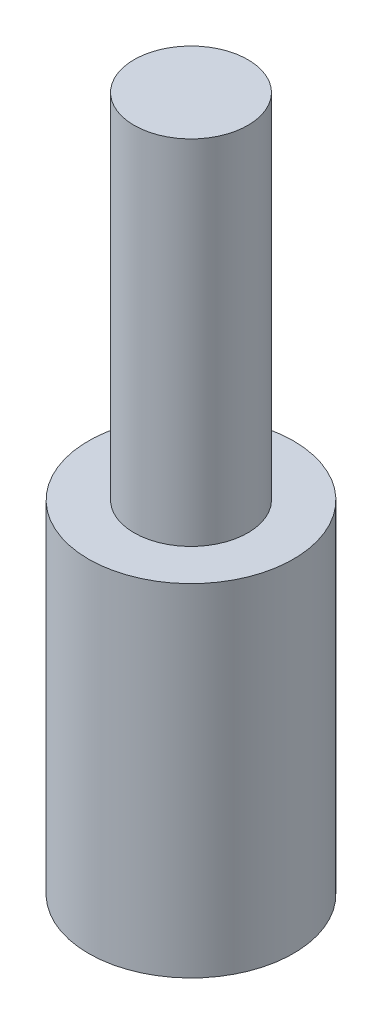
ISO-10303-21;
HEADER;
FILE_DESCRIPTION(('STEP AP214'),'2;1');
FILE_NAME('part.step','',(''),(''),'','','');
FILE_SCHEMA(('AUTOMOTIVE_DESIGN { 1 0 10303 214 1 1 1 1 }'));
ENDSEC;
DATA;
#1=APPLICATION_CONTEXT('core data for automotive mechanical design processes');
#2=APPLICATION_PROTOCOL_DEFINITION('international standard','automotive_design',2000,#1);
#3=PRODUCT_CONTEXT('',#1,'mechanical');
#4=PRODUCT('Part','Part','',(#3));
#5=PRODUCT_RELATED_PRODUCT_CATEGORY('part','',(#4));
#6=PRODUCT_DEFINITION_FORMATION('','',#4);
#7=PRODUCT_DEFINITION_CONTEXT('part definition',#1,'design');
#8=PRODUCT_DEFINITION('design','',#6,#7);
#9=PRODUCT_DEFINITION_SHAPE('','',#8);
#10=(LENGTH_UNIT() NAMED_UNIT(*) SI_UNIT(.MILLI.,.METRE.));
#11=(NAMED_UNIT(*) PLANE_ANGLE_UNIT() SI_UNIT($,.RADIAN.));
#12=(NAMED_UNIT(*) SI_UNIT($,.STERADIAN.) SOLID_ANGLE_UNIT());
#13=UNCERTAINTY_MEASURE_WITH_UNIT(LENGTH_MEASURE(1.E-05),#10,'distance_accuracy_value','');
#14=(GEOMETRIC_REPRESENTATION_CONTEXT(3) GLOBAL_UNCERTAINTY_ASSIGNED_CONTEXT((#13)) GLOBAL_UNIT_ASSIGNED_CONTEXT((#10,
#11,#12)) REPRESENTATION_CONTEXT('',''));
#15=CARTESIAN_POINT('',(0.,0.,0.));
#16=DIRECTION('',(0.,0.,1.));
#17=DIRECTION('',(1.,0.,0.));
#18=AXIS2_PLACEMENT_3D('',#15,#16,#17);
#19=CARTESIAN_POINT('',(0.,12.,0.));
#20=DIRECTION('',(0.,-1.,0.));
#21=DIRECTION('',(0.,0.,-1.));
#22=AXIS2_PLACEMENT_3D('',#19,#20,#21);
#23=CYLINDRICAL_SURFACE('',#22,3.);
#24=CARTESIAN_POINT('',(0.,0.,0.));
#25=DIRECTION('',(0.,1.,0.));
#26=DIRECTION('',(0.,0.,1.));
#27=AXIS2_PLACEMENT_3D('',#24,#25,#26);
#28=CIRCLE('',#27,3.);
#29=CARTESIAN_POINT('',(-1.6583123951777,0.,-2.5));
#30=VERTEX_POINT('',#29);
#31=CARTESIAN_POINT('',(1.6583123951777,0.,-2.5));
#32=VERTEX_POINT('',#31);
#33=EDGE_CURVE('E77',#30,#32,#28,.T.);
#34=ORIENTED_EDGE('',*,*,#33,.F.);
#35=DIRECTION('',(0.,-1.,0.));
#36=VECTOR('',#35,1.);
#37=CARTESIAN_POINT('',(-1.6583123951777,12.,-2.5));
#38=LINE('',#37,#36);
#39=CARTESIAN_POINT('',(-1.6583123951777,12.,-2.5));
#40=VERTEX_POINT('',#39);
#41=EDGE_CURVE('E40',#40,#30,#38,.T.);
#42=ORIENTED_EDGE('',*,*,#41,.F.);
#43=CARTESIAN_POINT('',(0.,12.,0.));
#44=DIRECTION('',(0.,1.,0.));
#45=DIRECTION('',(0.,0.,1.));
#46=AXIS2_PLACEMENT_3D('',#43,#44,#45);
#47=CIRCLE('',#46,3.);
#48=CARTESIAN_POINT('',(1.6583123951777,12.,-2.5));
#49=VERTEX_POINT('',#48);
#50=EDGE_CURVE('E62',#40,#49,#47,.T.);
#51=ORIENTED_EDGE('',*,*,#50,.T.);
#52=DIRECTION('',(0.,-1.,0.));
#53=VECTOR('',#52,1.);
#54=CARTESIAN_POINT('',(1.6583123951777,12.,-2.5));
#55=LINE('',#54,#53);
#56=EDGE_CURVE('E64',#49,#32,#55,.T.);
#57=ORIENTED_EDGE('',*,*,#56,.T.);
#58=EDGE_LOOP('',(#34,#42,#51,#57));
#59=FACE_BOUND('',#58,.T.);
#60=ADVANCED_FACE('F37',(#59),#23,.F.);
#61=CARTESIAN_POINT('',(0.,12.,-2.5));
#62=DIRECTION('',(0.,0.,-1.));
#63=DIRECTION('',(-1.,0.,0.));
#64=AXIS2_PLACEMENT_3D('',#61,#62,#63);
#65=PLANE('',#64);
#66=DIRECTION('',(1.,0.,0.));
#67=VECTOR('',#66,1.);
#68=CARTESIAN_POINT('',(0.,0.,-2.5));
#69=LINE('',#68,#67);
#70=EDGE_CURVE('E71',#30,#32,#69,.T.);
#71=ORIENTED_EDGE('',*,*,#70,.T.);
#72=ORIENTED_EDGE('',*,*,#56,.F.);
#73=DIRECTION('',(1.,0.,0.));
#74=VECTOR('',#73,1.);
#75=CARTESIAN_POINT('',(0.,12.,-2.5));
#76=LINE('',#75,#74);
#77=EDGE_CURVE('E67',#40,#49,#76,.T.);
#78=ORIENTED_EDGE('',*,*,#77,.F.);
#79=ORIENTED_EDGE('',*,*,#41,.T.);
#80=EDGE_LOOP('',(#71,#72,#78,#79));
#81=FACE_BOUND('',#80,.T.);
#82=ADVANCED_FACE('F70',(#81),#65,.F.);
#83=CARTESIAN_POINT('',(0.,12.,0.));
#84=DIRECTION('',(0.,-1.,0.));
#85=DIRECTION('',(0.,0.,-1.));
#86=AXIS2_PLACEMENT_3D('',#83,#84,#85);
#87=CYLINDRICAL_SURFACE('',#86,4.5);
#88=CARTESIAN_POINT('',(0.,0.,0.));
#89=DIRECTION('',(0.,1.,0.));
#90=DIRECTION('',(0.,0.,1.));
#91=AXIS2_PLACEMENT_3D('',#88,#89,#90);
#92=CIRCLE('',#91,4.5);
#93=CARTESIAN_POINT('',(0.,0.,4.5));
#94=VERTEX_POINT('',#93);
#95=EDGE_CURVE('E68',#94,#94,#92,.T.);
#96=ORIENTED_EDGE('',*,*,#95,.T.);
#97=EDGE_LOOP('',(#96));
#98=FACE_BOUND('',#97,.T.);
#99=CARTESIAN_POINT('',(0.,15.,0.));
#100=DIRECTION('',(0.,1.,0.));
#101=DIRECTION('',(0.,0.,1.));
#102=AXIS2_PLACEMENT_3D('',#99,#100,#101);
#103=CIRCLE('',#102,4.5);
#104=CARTESIAN_POINT('',(0.,15.,4.5));
#105=VERTEX_POINT('',#104);
#106=EDGE_CURVE('E79',#105,#105,#103,.T.);
#107=ORIENTED_EDGE('',*,*,#106,.F.);
#108=EDGE_LOOP('',(#107));
#109=FACE_BOUND('',#108,.T.);
#110=ADVANCED_FACE('F84',(#98,#109),#87,.T.);
#111=CARTESIAN_POINT('',(0.,0.,0.));
#112=DIRECTION('',(0.,1.,0.));
#113=DIRECTION('',(0.,0.,1.));
#114=AXIS2_PLACEMENT_3D('',#111,#112,#113);
#115=PLANE('',#114);
#116=ORIENTED_EDGE('',*,*,#33,.T.);
#117=ORIENTED_EDGE('',*,*,#70,.F.);
#118=EDGE_LOOP('',(#116,#117));
#119=FACE_BOUND('',#118,.T.);
#120=ORIENTED_EDGE('',*,*,#95,.F.);
#121=EDGE_LOOP('',(#120));
#122=FACE_BOUND('',#121,.T.);
#123=ADVANCED_FACE('F87',(#119,#122),#115,.F.);
#124=CARTESIAN_POINT('',(0.,12.,0.));
#125=DIRECTION('',(0.,1.,0.));
#126=DIRECTION('',(0.,0.,1.));
#127=AXIS2_PLACEMENT_3D('',#124,#125,#126);
#128=PLANE('',#127);
#129=ORIENTED_EDGE('',*,*,#50,.F.);
#130=ORIENTED_EDGE('',*,*,#77,.T.);
#131=EDGE_LOOP('',(#129,#130));
#132=FACE_BOUND('',#131,.T.);
#133=ADVANCED_FACE('F73',(#132),#128,.F.);
#134=CARTESIAN_POINT('',(0.,15.,0.));
#135=DIRECTION('',(0.,1.,0.));
#136=DIRECTION('',(0.,0.,1.));
#137=AXIS2_PLACEMENT_3D('',#134,#135,#136);
#138=PLANE('',#137);
#139=CARTESIAN_POINT('',(0.,15.,0.));
#140=DIRECTION('',(0.,1.,0.));
#141=DIRECTION('',(0.,0.,1.));
#142=AXIS2_PLACEMENT_3D('',#139,#140,#141);
#143=CIRCLE('',#142,2.5);
#144=CARTESIAN_POINT('',(0.,15.,2.5));
#145=VERTEX_POINT('',#144);
#146=EDGE_CURVE('E11',#145,#145,#143,.T.);
#147=ORIENTED_EDGE('',*,*,#146,.F.);
#148=EDGE_LOOP('',(#147));
#149=FACE_BOUND('',#148,.T.);
#150=ORIENTED_EDGE('',*,*,#106,.T.);
#151=EDGE_LOOP('',(#150));
#152=FACE_BOUND('',#151,.T.);
#153=ADVANCED_FACE('F95',(#149,#152),#138,.T.);
#154=CARTESIAN_POINT('',(0.,30.5,0.));
#155=DIRECTION('',(0.,-1.,0.));
#156=DIRECTION('',(0.,0.,-1.));
#157=AXIS2_PLACEMENT_3D('',#154,#155,#156);
#158=CYLINDRICAL_SURFACE('',#157,2.5);
#159=CARTESIAN_POINT('',(0.,30.5,0.));
#160=DIRECTION('',(0.,1.,0.));
#161=DIRECTION('',(0.,0.,1.));
#162=AXIS2_PLACEMENT_3D('',#159,#160,#161);
#163=CIRCLE('',#162,2.5);
#164=CARTESIAN_POINT('',(0.,30.5,2.5));
#165=VERTEX_POINT('',#164);
#166=EDGE_CURVE('E151',#165,#165,#163,.T.);
#167=ORIENTED_EDGE('',*,*,#166,.F.);
#168=EDGE_LOOP('',(#167));
#169=FACE_BOUND('',#168,.T.);
#170=ORIENTED_EDGE('',*,*,#146,.T.);
#171=EDGE_LOOP('',(#170));
#172=FACE_BOUND('',#171,.T.);
#173=ADVANCED_FACE('F125',(#169,#172),#158,.T.);
#174=CARTESIAN_POINT('',(0.,30.5,0.));
#175=DIRECTION('',(0.,1.,0.));
#176=DIRECTION('',(0.,0.,1.));
#177=AXIS2_PLACEMENT_3D('',#174,#175,#176);
#178=PLANE('',#177);
#179=ORIENTED_EDGE('',*,*,#166,.T.);
#180=EDGE_LOOP('',(#179));
#181=FACE_BOUND('',#180,.T.);
#182=ADVANCED_FACE('F135',(#181),#178,.T.);
#183=CLOSED_SHELL('',(#60,#82,#110,#123,#133,#153,#173,#182));
#184=MANIFOLD_SOLID_BREP('B2',#183);
#185=ADVANCED_BREP_SHAPE_REPRESENTATION('',(#18,#184),#14);
#186=SHAPE_DEFINITION_REPRESENTATION(#9,#185);
ENDSEC;
END-ISO-10303-21;
